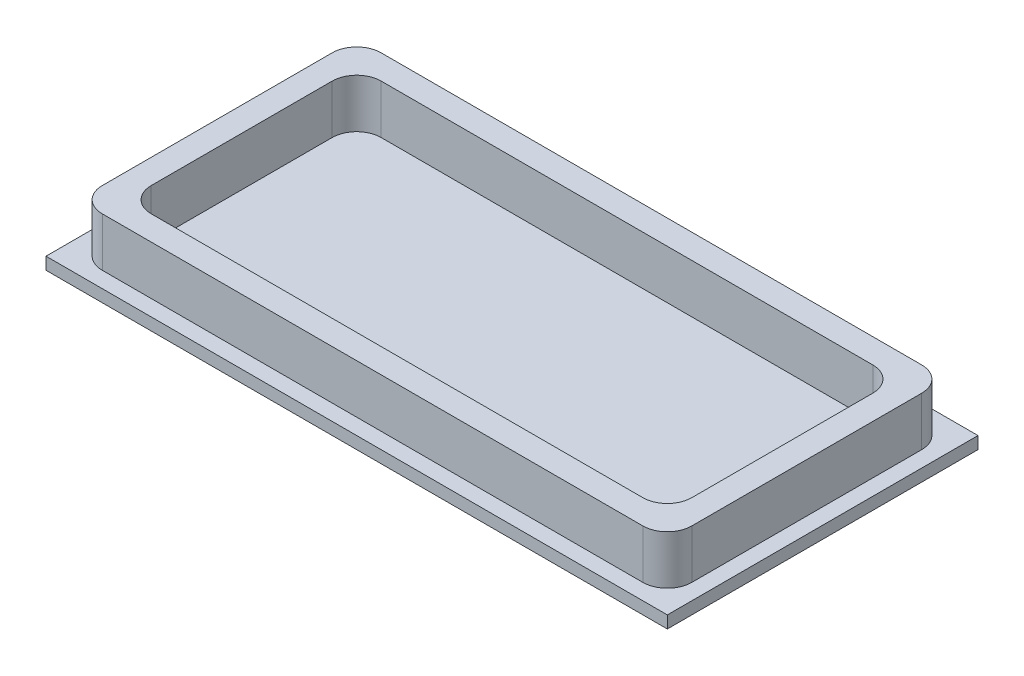
ISO-10303-21;
HEADER;
FILE_DESCRIPTION(('STEP AP214'),'2;1');
FILE_NAME('part.step','',(''),(''),'','','');
FILE_SCHEMA(('AUTOMOTIVE_DESIGN { 1 0 10303 214 1 1 1 1 }'));
ENDSEC;
DATA;
#1=APPLICATION_CONTEXT('core data for automotive mechanical design processes');
#2=APPLICATION_PROTOCOL_DEFINITION('international standard','automotive_design',2000,#1);
#3=PRODUCT_CONTEXT('',#1,'mechanical');
#4=PRODUCT('Part','Part','',(#3));
#5=PRODUCT_RELATED_PRODUCT_CATEGORY('part','',(#4));
#6=PRODUCT_DEFINITION_FORMATION('','',#4);
#7=PRODUCT_DEFINITION_CONTEXT('part definition',#1,'design');
#8=PRODUCT_DEFINITION('design','',#6,#7);
#9=PRODUCT_DEFINITION_SHAPE('','',#8);
#10=(LENGTH_UNIT() NAMED_UNIT(*) SI_UNIT(.MILLI.,.METRE.));
#11=(NAMED_UNIT(*) PLANE_ANGLE_UNIT() SI_UNIT($,.RADIAN.));
#12=(NAMED_UNIT(*) SI_UNIT($,.STERADIAN.) SOLID_ANGLE_UNIT());
#13=UNCERTAINTY_MEASURE_WITH_UNIT(LENGTH_MEASURE(1.E-05),#10,'distance_accuracy_value','');
#14=(GEOMETRIC_REPRESENTATION_CONTEXT(3) GLOBAL_UNCERTAINTY_ASSIGNED_CONTEXT((#13)) GLOBAL_UNIT_ASSIGNED_CONTEXT((#10,
#11,#12)) REPRESENTATION_CONTEXT('',''));
#15=CARTESIAN_POINT('',(0.,0.,0.));
#16=DIRECTION('',(0.,0.,1.));
#17=DIRECTION('',(1.,0.,0.));
#18=AXIS2_PLACEMENT_3D('',#15,#16,#17);
#19=CARTESIAN_POINT('',(0.,1.,0.));
#20=DIRECTION('',(0.,1.,0.));
#21=DIRECTION('',(0.,0.,1.));
#22=AXIS2_PLACEMENT_3D('',#19,#20,#21);
#23=PLANE('',#22);
#24=DIRECTION('',(0.,0.,1.));
#25=VECTOR('',#24,1.);
#26=CARTESIAN_POINT('',(-25.4,1.,12.7));
#27=LINE('',#26,#25);
#28=CARTESIAN_POINT('',(-25.4,1.,-12.7));
#29=VERTEX_POINT('',#28);
#30=CARTESIAN_POINT('',(-25.4,1.,12.7));
#31=VERTEX_POINT('',#30);
#32=EDGE_CURVE('E180',#29,#31,#27,.T.);
#33=ORIENTED_EDGE('',*,*,#32,.T.);
#34=DIRECTION('',(1.,0.,0.));
#35=VECTOR('',#34,1.);
#36=CARTESIAN_POINT('',(25.4,1.,12.7));
#37=LINE('',#36,#35);
#38=CARTESIAN_POINT('',(25.4,1.,12.7));
#39=VERTEX_POINT('',#38);
#40=EDGE_CURVE('E169',#31,#39,#37,.T.);
#41=ORIENTED_EDGE('',*,*,#40,.T.);
#42=DIRECTION('',(0.,0.,-1.));
#43=VECTOR('',#42,1.);
#44=CARTESIAN_POINT('',(25.4,1.,12.7));
#45=LINE('',#44,#43);
#46=CARTESIAN_POINT('',(25.4,1.,-12.7));
#47=VERTEX_POINT('',#46);
#48=EDGE_CURVE('E179',#39,#47,#45,.T.);
#49=ORIENTED_EDGE('',*,*,#48,.T.);
#50=DIRECTION('',(-1.,0.,0.));
#51=VECTOR('',#50,1.);
#52=CARTESIAN_POINT('',(25.4,1.,-12.7));
#53=LINE('',#52,#51);
#54=EDGE_CURVE('E184',#47,#29,#53,.T.);
#55=ORIENTED_EDGE('',*,*,#54,.T.);
#56=EDGE_LOOP('',(#33,#41,#49,#55));
#57=FACE_BOUND('',#56,.T.);
#58=DIRECTION('',(-1.,0.,0.));
#59=VECTOR('',#58,1.);
#60=CARTESIAN_POINT('',(-24.1,1.,-11.4));
#61=LINE('',#60,#59);
#62=CARTESIAN_POINT('',(22.1,1.,-11.4));
#63=VERTEX_POINT('',#62);
#64=CARTESIAN_POINT('',(-22.1,1.,-11.4));
#65=VERTEX_POINT('',#64);
#66=EDGE_CURVE('E267',#63,#65,#61,.T.);
#67=ORIENTED_EDGE('',*,*,#66,.F.);
#68=CARTESIAN_POINT('',(22.1,1.,-9.4));
#69=DIRECTION('',(0.,1.,0.));
#70=DIRECTION('',(0.,0.,1.));
#71=AXIS2_PLACEMENT_3D('',#68,#69,#70);
#72=CIRCLE('',#71,2.);
#73=CARTESIAN_POINT('',(24.1,1.,-9.4));
#74=VERTEX_POINT('',#73);
#75=EDGE_CURVE('E41',#63,#74,#72,.F.);
#76=ORIENTED_EDGE('',*,*,#75,.T.);
#77=DIRECTION('',(0.,0.,-1.));
#78=VECTOR('',#77,1.);
#79=CARTESIAN_POINT('',(24.1,1.,-11.4));
#80=LINE('',#79,#78);
#81=CARTESIAN_POINT('',(24.1,1.,9.4));
#82=VERTEX_POINT('',#81);
#83=EDGE_CURVE('E266',#82,#74,#80,.T.);
#84=ORIENTED_EDGE('',*,*,#83,.F.);
#85=CARTESIAN_POINT('',(22.1,1.,9.4));
#86=DIRECTION('',(0.,1.,0.));
#87=DIRECTION('',(0.,0.,1.));
#88=AXIS2_PLACEMENT_3D('',#85,#86,#87);
#89=CIRCLE('',#88,2.);
#90=CARTESIAN_POINT('',(22.1,1.,11.4));
#91=VERTEX_POINT('',#90);
#92=EDGE_CURVE('E263',#82,#91,#89,.F.);
#93=ORIENTED_EDGE('',*,*,#92,.T.);
#94=DIRECTION('',(1.,0.,0.));
#95=VECTOR('',#94,1.);
#96=CARTESIAN_POINT('',(-24.1,1.,11.4));
#97=LINE('',#96,#95);
#98=CARTESIAN_POINT('',(-22.1,1.,11.4));
#99=VERTEX_POINT('',#98);
#100=EDGE_CURVE('E293',#99,#91,#97,.T.);
#101=ORIENTED_EDGE('',*,*,#100,.F.);
#102=CARTESIAN_POINT('',(-22.1,1.,9.4));
#103=DIRECTION('',(0.,1.,0.));
#104=DIRECTION('',(0.,0.,1.));
#105=AXIS2_PLACEMENT_3D('',#102,#103,#104);
#106=CIRCLE('',#105,2.);
#107=CARTESIAN_POINT('',(-24.1,1.,9.4));
#108=VERTEX_POINT('',#107);
#109=EDGE_CURVE('E261',#99,#108,#106,.F.);
#110=ORIENTED_EDGE('',*,*,#109,.T.);
#111=DIRECTION('',(0.,0.,1.));
#112=VECTOR('',#111,1.);
#113=CARTESIAN_POINT('',(-24.1,1.,-11.4));
#114=LINE('',#113,#112);
#115=CARTESIAN_POINT('',(-24.1,1.,-9.4));
#116=VERTEX_POINT('',#115);
#117=EDGE_CURVE('E300',#116,#108,#114,.T.);
#118=ORIENTED_EDGE('',*,*,#117,.F.);
#119=CARTESIAN_POINT('',(-22.1,1.,-9.4));
#120=DIRECTION('',(0.,1.,0.));
#121=DIRECTION('',(0.,0.,1.));
#122=AXIS2_PLACEMENT_3D('',#119,#120,#121);
#123=CIRCLE('',#122,2.);
#124=EDGE_CURVE('E11',#116,#65,#123,.F.);
#125=ORIENTED_EDGE('',*,*,#124,.T.);
#126=EDGE_LOOP('',(#67,#76,#84,#93,#101,#110,#118,#125));
#127=FACE_BOUND('',#126,.T.);
#128=ADVANCED_FACE('F33',(#57,#127),#23,.T.);
#129=CARTESIAN_POINT('',(-25.4,1.,12.7));
#130=DIRECTION('',(1.,0.,0.));
#131=DIRECTION('',(0.,0.,-1.));
#132=AXIS2_PLACEMENT_3D('',#129,#130,#131);
#133=PLANE('',#132);
#134=DIRECTION('',(0.,0.,1.));
#135=VECTOR('',#134,1.);
#136=CARTESIAN_POINT('',(-25.4,0.,12.7));
#137=LINE('',#136,#135);
#138=CARTESIAN_POINT('',(-25.4,0.,-12.7));
#139=VERTEX_POINT('',#138);
#140=CARTESIAN_POINT('',(-25.4,0.,12.7));
#141=VERTEX_POINT('',#140);
#142=EDGE_CURVE('E192',#139,#141,#137,.T.);
#143=ORIENTED_EDGE('',*,*,#142,.T.);
#144=DIRECTION('',(0.,-1.,0.));
#145=VECTOR('',#144,1.);
#146=CARTESIAN_POINT('',(-25.4,1.,12.7));
#147=LINE('',#146,#145);
#148=EDGE_CURVE('E173',#31,#141,#147,.T.);
#149=ORIENTED_EDGE('',*,*,#148,.F.);
#150=ORIENTED_EDGE('',*,*,#32,.F.);
#151=DIRECTION('',(0.,-1.,0.));
#152=VECTOR('',#151,1.);
#153=CARTESIAN_POINT('',(-25.4,1.,-12.7));
#154=LINE('',#153,#152);
#155=EDGE_CURVE('E307',#29,#139,#154,.T.);
#156=ORIENTED_EDGE('',*,*,#155,.T.);
#157=EDGE_LOOP('',(#143,#149,#150,#156));
#158=FACE_BOUND('',#157,.T.);
#159=ADVANCED_FACE('F190',(#158),#133,.F.);
#160=CARTESIAN_POINT('',(25.4,1.,12.7));
#161=DIRECTION('',(0.,0.,-1.));
#162=DIRECTION('',(-1.,0.,0.));
#163=AXIS2_PLACEMENT_3D('',#160,#161,#162);
#164=PLANE('',#163);
#165=DIRECTION('',(1.,0.,0.));
#166=VECTOR('',#165,1.);
#167=CARTESIAN_POINT('',(25.4,0.,12.7));
#168=LINE('',#167,#166);
#169=CARTESIAN_POINT('',(25.4,0.,12.7));
#170=VERTEX_POINT('',#169);
#171=EDGE_CURVE('E309',#141,#170,#168,.T.);
#172=ORIENTED_EDGE('',*,*,#171,.T.);
#173=DIRECTION('',(0.,-1.,0.));
#174=VECTOR('',#173,1.);
#175=CARTESIAN_POINT('',(25.4,1.,12.7));
#176=LINE('',#175,#174);
#177=EDGE_CURVE('E176',#39,#170,#176,.T.);
#178=ORIENTED_EDGE('',*,*,#177,.F.);
#179=ORIENTED_EDGE('',*,*,#40,.F.);
#180=ORIENTED_EDGE('',*,*,#148,.T.);
#181=EDGE_LOOP('',(#172,#178,#179,#180));
#182=FACE_BOUND('',#181,.T.);
#183=ADVANCED_FACE('F171',(#182),#164,.F.);
#184=CARTESIAN_POINT('',(25.4,1.,12.7));
#185=DIRECTION('',(-1.,0.,0.));
#186=DIRECTION('',(0.,0.,1.));
#187=AXIS2_PLACEMENT_3D('',#184,#185,#186);
#188=PLANE('',#187);
#189=DIRECTION('',(0.,0.,-1.));
#190=VECTOR('',#189,1.);
#191=CARTESIAN_POINT('',(25.4,0.,12.7));
#192=LINE('',#191,#190);
#193=CARTESIAN_POINT('',(25.4,0.,-12.7));
#194=VERTEX_POINT('',#193);
#195=EDGE_CURVE('E311',#170,#194,#192,.T.);
#196=ORIENTED_EDGE('',*,*,#195,.T.);
#197=DIRECTION('',(0.,-1.,0.));
#198=VECTOR('',#197,1.);
#199=CARTESIAN_POINT('',(25.4,1.,-12.7));
#200=LINE('',#199,#198);
#201=EDGE_CURVE('E197',#47,#194,#200,.T.);
#202=ORIENTED_EDGE('',*,*,#201,.F.);
#203=ORIENTED_EDGE('',*,*,#48,.F.);
#204=ORIENTED_EDGE('',*,*,#177,.T.);
#205=EDGE_LOOP('',(#196,#202,#203,#204));
#206=FACE_BOUND('',#205,.T.);
#207=ADVANCED_FACE('F323',(#206),#188,.F.);
#208=CARTESIAN_POINT('',(25.4,1.,-12.7));
#209=DIRECTION('',(0.,0.,1.));
#210=DIRECTION('',(1.,0.,0.));
#211=AXIS2_PLACEMENT_3D('',#208,#209,#210);
#212=PLANE('',#211);
#213=DIRECTION('',(-1.,0.,0.));
#214=VECTOR('',#213,1.);
#215=CARTESIAN_POINT('',(25.4,0.,-12.7));
#216=LINE('',#215,#214);
#217=EDGE_CURVE('E188',#194,#139,#216,.T.);
#218=ORIENTED_EDGE('',*,*,#217,.T.);
#219=ORIENTED_EDGE('',*,*,#155,.F.);
#220=ORIENTED_EDGE('',*,*,#54,.F.);
#221=ORIENTED_EDGE('',*,*,#201,.T.);
#222=EDGE_LOOP('',(#218,#219,#220,#221));
#223=FACE_BOUND('',#222,.T.);
#224=ADVANCED_FACE('F318',(#223),#212,.F.);
#225=CARTESIAN_POINT('',(0.,0.,0.));
#226=DIRECTION('',(0.,1.,0.));
#227=DIRECTION('',(0.,0.,1.));
#228=AXIS2_PLACEMENT_3D('',#225,#226,#227);
#229=PLANE('',#228);
#230=ORIENTED_EDGE('',*,*,#142,.F.);
#231=ORIENTED_EDGE('',*,*,#217,.F.);
#232=ORIENTED_EDGE('',*,*,#195,.F.);
#233=ORIENTED_EDGE('',*,*,#171,.F.);
#234=EDGE_LOOP('',(#230,#231,#232,#233));
#235=FACE_BOUND('',#234,.T.);
#236=ADVANCED_FACE('F322',(#235),#229,.F.);
#237=CARTESIAN_POINT('',(0.,5.,0.));
#238=DIRECTION('',(0.,1.,0.));
#239=DIRECTION('',(0.,0.,1.));
#240=AXIS2_PLACEMENT_3D('',#237,#238,#239);
#241=PLANE('',#240);
#242=DIRECTION('',(0.,0.,1.));
#243=VECTOR('',#242,1.);
#244=CARTESIAN_POINT('',(-24.1,5.,-11.4));
#245=LINE('',#244,#243);
#246=CARTESIAN_POINT('',(-24.1,5.,-9.4));
#247=VERTEX_POINT('',#246);
#248=CARTESIAN_POINT('',(-24.1,5.,9.4));
#249=VERTEX_POINT('',#248);
#250=EDGE_CURVE('E289',#247,#249,#245,.T.);
#251=ORIENTED_EDGE('',*,*,#250,.T.);
#252=CARTESIAN_POINT('',(-22.1,5.,9.4));
#253=DIRECTION('',(0.,1.,0.));
#254=DIRECTION('',(0.,0.,1.));
#255=AXIS2_PLACEMENT_3D('',#252,#253,#254);
#256=CIRCLE('',#255,2.);
#257=CARTESIAN_POINT('',(-22.1,5.,11.4));
#258=VERTEX_POINT('',#257);
#259=EDGE_CURVE('E242',#249,#258,#256,.T.);
#260=ORIENTED_EDGE('',*,*,#259,.T.);
#261=DIRECTION('',(1.,0.,0.));
#262=VECTOR('',#261,1.);
#263=CARTESIAN_POINT('',(-24.1,5.,11.4));
#264=LINE('',#263,#262);
#265=CARTESIAN_POINT('',(22.1,5.,11.4));
#266=VERTEX_POINT('',#265);
#267=EDGE_CURVE('E291',#258,#266,#264,.T.);
#268=ORIENTED_EDGE('',*,*,#267,.T.);
#269=CARTESIAN_POINT('',(22.1,5.,9.4));
#270=DIRECTION('',(0.,1.,0.));
#271=DIRECTION('',(0.,0.,1.));
#272=AXIS2_PLACEMENT_3D('',#269,#270,#271);
#273=CIRCLE('',#272,2.);
#274=CARTESIAN_POINT('',(24.1,5.,9.4));
#275=VERTEX_POINT('',#274);
#276=EDGE_CURVE('E240',#266,#275,#273,.T.);
#277=ORIENTED_EDGE('',*,*,#276,.T.);
#278=DIRECTION('',(0.,0.,-1.));
#279=VECTOR('',#278,1.);
#280=CARTESIAN_POINT('',(24.1,5.,-11.4));
#281=LINE('',#280,#279);
#282=CARTESIAN_POINT('',(24.1,5.,-9.4));
#283=VERTEX_POINT('',#282);
#284=EDGE_CURVE('E285',#275,#283,#281,.T.);
#285=ORIENTED_EDGE('',*,*,#284,.T.);
#286=CARTESIAN_POINT('',(22.1,5.,-9.4));
#287=DIRECTION('',(0.,1.,0.));
#288=DIRECTION('',(0.,0.,1.));
#289=AXIS2_PLACEMENT_3D('',#286,#287,#288);
#290=CIRCLE('',#289,2.);
#291=CARTESIAN_POINT('',(22.1,5.,-11.4));
#292=VERTEX_POINT('',#291);
#293=EDGE_CURVE('E238',#283,#292,#290,.T.);
#294=ORIENTED_EDGE('',*,*,#293,.T.);
#295=DIRECTION('',(-1.,0.,0.));
#296=VECTOR('',#295,1.);
#297=CARTESIAN_POINT('',(-24.1,5.,-11.4));
#298=LINE('',#297,#296);
#299=CARTESIAN_POINT('',(-22.1,5.,-11.4));
#300=VERTEX_POINT('',#299);
#301=EDGE_CURVE('E283',#292,#300,#298,.T.);
#302=ORIENTED_EDGE('',*,*,#301,.T.);
#303=CARTESIAN_POINT('',(-22.1,5.,-9.4));
#304=DIRECTION('',(0.,1.,0.));
#305=DIRECTION('',(0.,0.,1.));
#306=AXIS2_PLACEMENT_3D('',#303,#304,#305);
#307=CIRCLE('',#306,2.);
#308=EDGE_CURVE('E236',#300,#247,#307,.T.);
#309=ORIENTED_EDGE('',*,*,#308,.T.);
#310=EDGE_LOOP('',(#251,#260,#268,#277,#285,#294,#302,#309));
#311=FACE_BOUND('',#310,.T.);
#312=DIRECTION('',(0.,0.,1.));
#313=VECTOR('',#312,1.);
#314=CARTESIAN_POINT('',(-22.1,5.,-9.4));
#315=LINE('',#314,#313);
#316=CARTESIAN_POINT('',(-22.1,5.,-7.4));
#317=VERTEX_POINT('',#316);
#318=CARTESIAN_POINT('',(-22.1,5.,7.4));
#319=VERTEX_POINT('',#318);
#320=EDGE_CURVE('E374',#317,#319,#315,.T.);
#321=ORIENTED_EDGE('',*,*,#320,.F.);
#322=CARTESIAN_POINT('',(-20.1,5.,-7.4));
#323=DIRECTION('',(0.,1.,0.));
#324=DIRECTION('',(0.,0.,1.));
#325=AXIS2_PLACEMENT_3D('',#322,#323,#324);
#326=CIRCLE('',#325,2.);
#327=CARTESIAN_POINT('',(-20.1,5.,-9.4));
#328=VERTEX_POINT('',#327);
#329=EDGE_CURVE('E259',#317,#328,#326,.F.);
#330=ORIENTED_EDGE('',*,*,#329,.T.);
#331=DIRECTION('',(-1.,0.,0.));
#332=VECTOR('',#331,1.);
#333=CARTESIAN_POINT('',(-22.1,5.,-9.4));
#334=LINE('',#333,#332);
#335=CARTESIAN_POINT('',(20.1,5.,-9.4));
#336=VERTEX_POINT('',#335);
#337=EDGE_CURVE('E371',#336,#328,#334,.T.);
#338=ORIENTED_EDGE('',*,*,#337,.F.);
#339=CARTESIAN_POINT('',(20.1,5.,-7.4));
#340=DIRECTION('',(0.,1.,0.));
#341=DIRECTION('',(0.,0.,1.));
#342=AXIS2_PLACEMENT_3D('',#339,#340,#341);
#343=CIRCLE('',#342,2.);
#344=CARTESIAN_POINT('',(22.1,5.,-7.4));
#345=VERTEX_POINT('',#344);
#346=EDGE_CURVE('E257',#336,#345,#343,.F.);
#347=ORIENTED_EDGE('',*,*,#346,.T.);
#348=DIRECTION('',(0.,0.,-1.));
#349=VECTOR('',#348,1.);
#350=CARTESIAN_POINT('',(22.1,5.,-9.4));
#351=LINE('',#350,#349);
#352=CARTESIAN_POINT('',(22.1,5.,7.4));
#353=VERTEX_POINT('',#352);
#354=EDGE_CURVE('E273',#353,#345,#351,.T.);
#355=ORIENTED_EDGE('',*,*,#354,.F.);
#356=CARTESIAN_POINT('',(20.1,5.,7.4));
#357=DIRECTION('',(0.,1.,0.));
#358=DIRECTION('',(0.,0.,1.));
#359=AXIS2_PLACEMENT_3D('',#356,#357,#358);
#360=CIRCLE('',#359,2.);
#361=CARTESIAN_POINT('',(20.1,5.,9.4));
#362=VERTEX_POINT('',#361);
#363=EDGE_CURVE('E255',#353,#362,#360,.F.);
#364=ORIENTED_EDGE('',*,*,#363,.T.);
#365=DIRECTION('',(1.,0.,0.));
#366=VECTOR('',#365,1.);
#367=CARTESIAN_POINT('',(-22.1,5.,9.4));
#368=LINE('',#367,#366);
#369=CARTESIAN_POINT('',(-20.1,5.,9.4));
#370=VERTEX_POINT('',#369);
#371=EDGE_CURVE('E380',#370,#362,#368,.T.);
#372=ORIENTED_EDGE('',*,*,#371,.F.);
#373=CARTESIAN_POINT('',(-20.1,5.,7.4));
#374=DIRECTION('',(0.,1.,0.));
#375=DIRECTION('',(0.,0.,1.));
#376=AXIS2_PLACEMENT_3D('',#373,#374,#375);
#377=CIRCLE('',#376,2.);
#378=EDGE_CURVE('E253',#370,#319,#377,.F.);
#379=ORIENTED_EDGE('',*,*,#378,.T.);
#380=EDGE_LOOP('',(#321,#330,#338,#347,#355,#364,#372,#379));
#381=FACE_BOUND('',#380,.T.);
#382=ADVANCED_FACE('F281',(#311,#381),#241,.T.);
#383=CARTESIAN_POINT('',(24.1,5.,-11.4));
#384=DIRECTION('',(-1.,0.,0.));
#385=DIRECTION('',(0.,0.,1.));
#386=AXIS2_PLACEMENT_3D('',#383,#384,#385);
#387=PLANE('',#386);
#388=ORIENTED_EDGE('',*,*,#284,.F.);
#389=DIRECTION('',(0.,-1.,0.));
#390=VECTOR('',#389,1.);
#391=CARTESIAN_POINT('',(24.1,5.,9.4));
#392=LINE('',#391,#390);
#393=EDGE_CURVE('E246',#275,#82,#392,.T.);
#394=ORIENTED_EDGE('',*,*,#393,.T.);
#395=ORIENTED_EDGE('',*,*,#83,.T.);
#396=DIRECTION('',(0.,-1.,0.));
#397=VECTOR('',#396,1.);
#398=CARTESIAN_POINT('',(24.1,5.,-9.4));
#399=LINE('',#398,#397);
#400=EDGE_CURVE('E244',#74,#283,#399,.F.);
#401=ORIENTED_EDGE('',*,*,#400,.T.);
#402=EDGE_LOOP('',(#388,#394,#395,#401));
#403=FACE_BOUND('',#402,.T.);
#404=ADVANCED_FACE('F270',(#403),#387,.F.);
#405=CARTESIAN_POINT('',(-24.1,5.,-11.4));
#406=DIRECTION('',(0.,0.,1.));
#407=DIRECTION('',(1.,0.,0.));
#408=AXIS2_PLACEMENT_3D('',#405,#406,#407);
#409=PLANE('',#408);
#410=ORIENTED_EDGE('',*,*,#301,.F.);
#411=DIRECTION('',(0.,-1.,0.));
#412=VECTOR('',#411,1.);
#413=CARTESIAN_POINT('',(22.1,5.,-11.4));
#414=LINE('',#413,#412);
#415=EDGE_CURVE('E251',#292,#63,#414,.T.);
#416=ORIENTED_EDGE('',*,*,#415,.T.);
#417=ORIENTED_EDGE('',*,*,#66,.T.);
#418=DIRECTION('',(0.,-1.,0.));
#419=VECTOR('',#418,1.);
#420=CARTESIAN_POINT('',(-22.1,5.,-11.4));
#421=LINE('',#420,#419);
#422=EDGE_CURVE('E249',#65,#300,#421,.F.);
#423=ORIENTED_EDGE('',*,*,#422,.T.);
#424=EDGE_LOOP('',(#410,#416,#417,#423));
#425=FACE_BOUND('',#424,.T.);
#426=ADVANCED_FACE('F287',(#425),#409,.F.);
#427=CARTESIAN_POINT('',(-24.1,5.,-11.4));
#428=DIRECTION('',(1.,0.,0.));
#429=DIRECTION('',(0.,0.,-1.));
#430=AXIS2_PLACEMENT_3D('',#427,#428,#429);
#431=PLANE('',#430);
#432=ORIENTED_EDGE('',*,*,#117,.T.);
#433=DIRECTION('',(0.,-1.,0.));
#434=VECTOR('',#433,1.);
#435=CARTESIAN_POINT('',(-24.1,5.,9.4));
#436=LINE('',#435,#434);
#437=EDGE_CURVE('E234',#108,#249,#436,.F.);
#438=ORIENTED_EDGE('',*,*,#437,.T.);
#439=ORIENTED_EDGE('',*,*,#250,.F.);
#440=DIRECTION('',(0.,-1.,0.));
#441=VECTOR('',#440,1.);
#442=CARTESIAN_POINT('',(-24.1,5.,-9.4));
#443=LINE('',#442,#441);
#444=EDGE_CURVE('E231',#247,#116,#443,.T.);
#445=ORIENTED_EDGE('',*,*,#444,.T.);
#446=EDGE_LOOP('',(#432,#438,#439,#445));
#447=FACE_BOUND('',#446,.T.);
#448=ADVANCED_FACE('F434',(#447),#431,.F.);
#449=CARTESIAN_POINT('',(-24.1,5.,11.4));
#450=DIRECTION('',(0.,0.,-1.));
#451=DIRECTION('',(-1.,0.,0.));
#452=AXIS2_PLACEMENT_3D('',#449,#450,#451);
#453=PLANE('',#452);
#454=ORIENTED_EDGE('',*,*,#267,.F.);
#455=DIRECTION('',(0.,-1.,0.));
#456=VECTOR('',#455,1.);
#457=CARTESIAN_POINT('',(-22.1,5.,11.4));
#458=LINE('',#457,#456);
#459=EDGE_CURVE('E228',#258,#99,#458,.T.);
#460=ORIENTED_EDGE('',*,*,#459,.T.);
#461=ORIENTED_EDGE('',*,*,#100,.T.);
#462=DIRECTION('',(0.,-1.,0.));
#463=VECTOR('',#462,1.);
#464=CARTESIAN_POINT('',(22.1,5.,11.4));
#465=LINE('',#464,#463);
#466=EDGE_CURVE('E226',#91,#266,#465,.F.);
#467=ORIENTED_EDGE('',*,*,#466,.T.);
#468=EDGE_LOOP('',(#454,#460,#461,#467));
#469=FACE_BOUND('',#468,.T.);
#470=ADVANCED_FACE('F440',(#469),#453,.F.);
#471=CARTESIAN_POINT('',(-22.1,5.,-9.4));
#472=DIRECTION('',(0.,0.,1.));
#473=DIRECTION('',(1.,0.,0.));
#474=AXIS2_PLACEMENT_3D('',#471,#472,#473);
#475=PLANE('',#474);
#476=DIRECTION('',(-1.,0.,0.));
#477=VECTOR('',#476,1.);
#478=CARTESIAN_POINT('',(-22.1,1.,-9.4));
#479=LINE('',#478,#477);
#480=CARTESIAN_POINT('',(20.1,1.,-9.4));
#481=VERTEX_POINT('',#480);
#482=CARTESIAN_POINT('',(-20.1,1.,-9.4));
#483=VERTEX_POINT('',#482);
#484=EDGE_CURVE('E364',#481,#483,#479,.T.);
#485=ORIENTED_EDGE('',*,*,#484,.F.);
#486=DIRECTION('',(0.,-1.,0.));
#487=VECTOR('',#486,1.);
#488=CARTESIAN_POINT('',(20.1,5.,-9.4));
#489=LINE('',#488,#487);
#490=EDGE_CURVE('E224',#481,#336,#489,.F.);
#491=ORIENTED_EDGE('',*,*,#490,.T.);
#492=ORIENTED_EDGE('',*,*,#337,.T.);
#493=DIRECTION('',(0.,-1.,0.));
#494=VECTOR('',#493,1.);
#495=CARTESIAN_POINT('',(-20.1,1.,-9.4));
#496=LINE('',#495,#494);
#497=EDGE_CURVE('E221',#328,#483,#496,.T.);
#498=ORIENTED_EDGE('',*,*,#497,.T.);
#499=EDGE_LOOP('',(#485,#491,#492,#498));
#500=FACE_BOUND('',#499,.T.);
#501=ADVANCED_FACE('F394',(#500),#475,.T.);
#502=CARTESIAN_POINT('',(-22.1,5.,-9.4));
#503=DIRECTION('',(1.,0.,0.));
#504=DIRECTION('',(0.,0.,-1.));
#505=AXIS2_PLACEMENT_3D('',#502,#503,#504);
#506=PLANE('',#505);
#507=ORIENTED_EDGE('',*,*,#320,.T.);
#508=DIRECTION('',(0.,-1.,0.));
#509=VECTOR('',#508,1.);
#510=CARTESIAN_POINT('',(-22.1,1.,7.4));
#511=LINE('',#510,#509);
#512=CARTESIAN_POINT('',(-22.1,1.,7.4));
#513=VERTEX_POINT('',#512);
#514=EDGE_CURVE('E195',#319,#513,#511,.T.);
#515=ORIENTED_EDGE('',*,*,#514,.T.);
#516=DIRECTION('',(0.,0.,1.));
#517=VECTOR('',#516,1.);
#518=CARTESIAN_POINT('',(-22.1,1.,-9.4));
#519=LINE('',#518,#517);
#520=CARTESIAN_POINT('',(-22.1,1.,-7.4));
#521=VERTEX_POINT('',#520);
#522=EDGE_CURVE('E357',#521,#513,#519,.T.);
#523=ORIENTED_EDGE('',*,*,#522,.F.);
#524=DIRECTION('',(0.,-1.,0.));
#525=VECTOR('',#524,1.);
#526=CARTESIAN_POINT('',(-22.1,5.,-7.4));
#527=LINE('',#526,#525);
#528=EDGE_CURVE('E193',#521,#317,#527,.F.);
#529=ORIENTED_EDGE('',*,*,#528,.T.);
#530=EDGE_LOOP('',(#507,#515,#523,#529));
#531=FACE_BOUND('',#530,.T.);
#532=ADVANCED_FACE('F399',(#531),#506,.T.);
#533=CARTESIAN_POINT('',(-22.1,5.,9.4));
#534=DIRECTION('',(0.,0.,-1.));
#535=DIRECTION('',(-1.,0.,0.));
#536=AXIS2_PLACEMENT_3D('',#533,#534,#535);
#537=PLANE('',#536);
#538=DIRECTION('',(1.,0.,0.));
#539=VECTOR('',#538,1.);
#540=CARTESIAN_POINT('',(-22.1,1.,9.4));
#541=LINE('',#540,#539);
#542=CARTESIAN_POINT('',(-20.1,1.,9.4));
#543=VERTEX_POINT('',#542);
#544=CARTESIAN_POINT('',(20.1,1.,9.4));
#545=VERTEX_POINT('',#544);
#546=EDGE_CURVE('E363',#543,#545,#541,.T.);
#547=ORIENTED_EDGE('',*,*,#546,.F.);
#548=DIRECTION('',(0.,-1.,0.));
#549=VECTOR('',#548,1.);
#550=CARTESIAN_POINT('',(-20.1,5.,9.4));
#551=LINE('',#550,#549);
#552=EDGE_CURVE('E214',#543,#370,#551,.F.);
#553=ORIENTED_EDGE('',*,*,#552,.T.);
#554=ORIENTED_EDGE('',*,*,#371,.T.);
#555=DIRECTION('',(0.,-1.,0.));
#556=VECTOR('',#555,1.);
#557=CARTESIAN_POINT('',(20.1,1.,9.4));
#558=LINE('',#557,#556);
#559=EDGE_CURVE('E211',#362,#545,#558,.T.);
#560=ORIENTED_EDGE('',*,*,#559,.T.);
#561=EDGE_LOOP('',(#547,#553,#554,#560));
#562=FACE_BOUND('',#561,.T.);
#563=ADVANCED_FACE('F352',(#562),#537,.T.);
#564=CARTESIAN_POINT('',(22.1,5.,-9.4));
#565=DIRECTION('',(-1.,0.,0.));
#566=DIRECTION('',(0.,0.,1.));
#567=AXIS2_PLACEMENT_3D('',#564,#565,#566);
#568=PLANE('',#567);
#569=DIRECTION('',(0.,0.,-1.));
#570=VECTOR('',#569,1.);
#571=CARTESIAN_POINT('',(22.1,1.,-9.4));
#572=LINE('',#571,#570);
#573=CARTESIAN_POINT('',(22.1,1.,7.4));
#574=VERTEX_POINT('',#573);
#575=CARTESIAN_POINT('',(22.1,1.,-7.4));
#576=VERTEX_POINT('',#575);
#577=EDGE_CURVE('E366',#574,#576,#572,.T.);
#578=ORIENTED_EDGE('',*,*,#577,.F.);
#579=DIRECTION('',(0.,-1.,0.));
#580=VECTOR('',#579,1.);
#581=CARTESIAN_POINT('',(22.1,5.,7.4));
#582=LINE('',#581,#580);
#583=EDGE_CURVE('E219',#574,#353,#582,.F.);
#584=ORIENTED_EDGE('',*,*,#583,.T.);
#585=ORIENTED_EDGE('',*,*,#354,.T.);
#586=DIRECTION('',(0.,-1.,0.));
#587=VECTOR('',#586,1.);
#588=CARTESIAN_POINT('',(22.1,1.,-7.4));
#589=LINE('',#588,#587);
#590=EDGE_CURVE('E216',#345,#576,#589,.T.);
#591=ORIENTED_EDGE('',*,*,#590,.T.);
#592=EDGE_LOOP('',(#578,#584,#585,#591));
#593=FACE_BOUND('',#592,.T.);
#594=ADVANCED_FACE('F343',(#593),#568,.T.);
#595=ORIENTED_EDGE('',*,*,#522,.T.);
#596=CARTESIAN_POINT('',(-20.1,1.,7.4));
#597=DIRECTION('',(0.,1.,0.));
#598=DIRECTION('',(0.,0.,1.));
#599=AXIS2_PLACEMENT_3D('',#596,#597,#598);
#600=CIRCLE('',#599,2.);
#601=EDGE_CURVE('E209',#513,#543,#600,.T.);
#602=ORIENTED_EDGE('',*,*,#601,.T.);
#603=ORIENTED_EDGE('',*,*,#546,.T.);
#604=CARTESIAN_POINT('',(20.1,1.,7.4));
#605=DIRECTION('',(0.,1.,0.));
#606=DIRECTION('',(0.,0.,1.));
#607=AXIS2_PLACEMENT_3D('',#604,#605,#606);
#608=CIRCLE('',#607,2.);
#609=EDGE_CURVE('E207',#545,#574,#608,.T.);
#610=ORIENTED_EDGE('',*,*,#609,.T.);
#611=ORIENTED_EDGE('',*,*,#577,.T.);
#612=CARTESIAN_POINT('',(20.1,1.,-7.4));
#613=DIRECTION('',(0.,1.,0.));
#614=DIRECTION('',(0.,0.,1.));
#615=AXIS2_PLACEMENT_3D('',#612,#613,#614);
#616=CIRCLE('',#615,2.);
#617=EDGE_CURVE('E205',#576,#481,#616,.T.);
#618=ORIENTED_EDGE('',*,*,#617,.T.);
#619=ORIENTED_EDGE('',*,*,#484,.T.);
#620=CARTESIAN_POINT('',(-20.1,1.,-7.4));
#621=DIRECTION('',(0.,1.,0.));
#622=DIRECTION('',(0.,0.,1.));
#623=AXIS2_PLACEMENT_3D('',#620,#621,#622);
#624=CIRCLE('',#623,2.);
#625=EDGE_CURVE('E203',#483,#521,#624,.T.);
#626=ORIENTED_EDGE('',*,*,#625,.T.);
#627=EDGE_LOOP('',(#595,#602,#603,#610,#611,#618,#619,#626));
#628=FACE_BOUND('',#627,.T.);
#629=ADVANCED_FACE('F334',(#628),#23,.T.);
#630=CARTESIAN_POINT('',(-20.1,5.,7.4));
#631=DIRECTION('',(0.,1.,0.));
#632=DIRECTION('',(0.,0.,1.));
#633=AXIS2_PLACEMENT_3D('',#630,#631,#632);
#634=CYLINDRICAL_SURFACE('',#633,2.);
#635=ORIENTED_EDGE('',*,*,#378,.F.);
#636=ORIENTED_EDGE('',*,*,#552,.F.);
#637=ORIENTED_EDGE('',*,*,#601,.F.);
#638=ORIENTED_EDGE('',*,*,#514,.F.);
#639=EDGE_LOOP('',(#635,#636,#637,#638));
#640=FACE_BOUND('',#639,.T.);
#641=ADVANCED_FACE('F342',(#640),#634,.F.);
#642=CARTESIAN_POINT('',(20.1,5.,7.4));
#643=DIRECTION('',(0.,1.,0.));
#644=DIRECTION('',(0.,0.,1.));
#645=AXIS2_PLACEMENT_3D('',#642,#643,#644);
#646=CYLINDRICAL_SURFACE('',#645,2.);
#647=ORIENTED_EDGE('',*,*,#363,.F.);
#648=ORIENTED_EDGE('',*,*,#583,.F.);
#649=ORIENTED_EDGE('',*,*,#609,.F.);
#650=ORIENTED_EDGE('',*,*,#559,.F.);
#651=EDGE_LOOP('',(#647,#648,#649,#650));
#652=FACE_BOUND('',#651,.T.);
#653=ADVANCED_FACE('F349',(#652),#646,.F.);
#654=CARTESIAN_POINT('',(20.1,5.,-7.4));
#655=DIRECTION('',(0.,1.,0.));
#656=DIRECTION('',(0.,0.,1.));
#657=AXIS2_PLACEMENT_3D('',#654,#655,#656);
#658=CYLINDRICAL_SURFACE('',#657,2.);
#659=ORIENTED_EDGE('',*,*,#346,.F.);
#660=ORIENTED_EDGE('',*,*,#490,.F.);
#661=ORIENTED_EDGE('',*,*,#617,.F.);
#662=ORIENTED_EDGE('',*,*,#590,.F.);
#663=EDGE_LOOP('',(#659,#660,#661,#662));
#664=FACE_BOUND('',#663,.T.);
#665=ADVANCED_FACE('F391',(#664),#658,.F.);
#666=CARTESIAN_POINT('',(-20.1,5.,-7.4));
#667=DIRECTION('',(0.,1.,0.));
#668=DIRECTION('',(0.,0.,1.));
#669=AXIS2_PLACEMENT_3D('',#666,#667,#668);
#670=CYLINDRICAL_SURFACE('',#669,2.);
#671=ORIENTED_EDGE('',*,*,#329,.F.);
#672=ORIENTED_EDGE('',*,*,#528,.F.);
#673=ORIENTED_EDGE('',*,*,#625,.F.);
#674=ORIENTED_EDGE('',*,*,#497,.F.);
#675=EDGE_LOOP('',(#671,#672,#673,#674));
#676=FACE_BOUND('',#675,.T.);
#677=ADVANCED_FACE('F397',(#676),#670,.F.);
#678=CARTESIAN_POINT('',(-22.1,5.,9.4));
#679=DIRECTION('',(0.,-1.,0.));
#680=DIRECTION('',(0.,0.,-1.));
#681=AXIS2_PLACEMENT_3D('',#678,#679,#680);
#682=CYLINDRICAL_SURFACE('',#681,2.);
#683=ORIENTED_EDGE('',*,*,#259,.F.);
#684=ORIENTED_EDGE('',*,*,#437,.F.);
#685=ORIENTED_EDGE('',*,*,#109,.F.);
#686=ORIENTED_EDGE('',*,*,#459,.F.);
#687=EDGE_LOOP('',(#683,#684,#685,#686));
#688=FACE_BOUND('',#687,.T.);
#689=ADVANCED_FACE('F416',(#688),#682,.T.);
#690=CARTESIAN_POINT('',(22.1,5.,9.4));
#691=DIRECTION('',(0.,-1.,0.));
#692=DIRECTION('',(0.,0.,-1.));
#693=AXIS2_PLACEMENT_3D('',#690,#691,#692);
#694=CYLINDRICAL_SURFACE('',#693,2.);
#695=ORIENTED_EDGE('',*,*,#276,.F.);
#696=ORIENTED_EDGE('',*,*,#466,.F.);
#697=ORIENTED_EDGE('',*,*,#92,.F.);
#698=ORIENTED_EDGE('',*,*,#393,.F.);
#699=EDGE_LOOP('',(#695,#696,#697,#698));
#700=FACE_BOUND('',#699,.T.);
#701=ADVANCED_FACE('F419',(#700),#694,.T.);
#702=CARTESIAN_POINT('',(22.1,5.,-9.4));
#703=DIRECTION('',(0.,-1.,0.));
#704=DIRECTION('',(0.,0.,-1.));
#705=AXIS2_PLACEMENT_3D('',#702,#703,#704);
#706=CYLINDRICAL_SURFACE('',#705,2.);
#707=ORIENTED_EDGE('',*,*,#293,.F.);
#708=ORIENTED_EDGE('',*,*,#400,.F.);
#709=ORIENTED_EDGE('',*,*,#75,.F.);
#710=ORIENTED_EDGE('',*,*,#415,.F.);
#711=EDGE_LOOP('',(#707,#708,#709,#710));
#712=FACE_BOUND('',#711,.T.);
#713=ADVANCED_FACE('F276',(#712),#706,.T.);
#714=CARTESIAN_POINT('',(-22.1,5.,-9.4));
#715=DIRECTION('',(0.,-1.,0.));
#716=DIRECTION('',(0.,0.,-1.));
#717=AXIS2_PLACEMENT_3D('',#714,#715,#716);
#718=CYLINDRICAL_SURFACE('',#717,2.);
#719=ORIENTED_EDGE('',*,*,#308,.F.);
#720=ORIENTED_EDGE('',*,*,#422,.F.);
#721=ORIENTED_EDGE('',*,*,#124,.F.);
#722=ORIENTED_EDGE('',*,*,#444,.F.);
#723=EDGE_LOOP('',(#719,#720,#721,#722));
#724=FACE_BOUND('',#723,.T.);
#725=ADVANCED_FACE('F35',(#724),#718,.T.);
#726=CLOSED_SHELL('',(#128,#159,#183,#207,#224,#236,#382,#404,#426,#448,#470,#501,#532,#563,
#594,#629,#641,#653,#665,#677,#689,#701,#713,#725));
#727=MANIFOLD_SOLID_BREP('B2',#726);
#728=ADVANCED_BREP_SHAPE_REPRESENTATION('',(#18,#727),#14);
#729=SHAPE_DEFINITION_REPRESENTATION(#9,#728);
ENDSEC;
END-ISO-10303-21;
